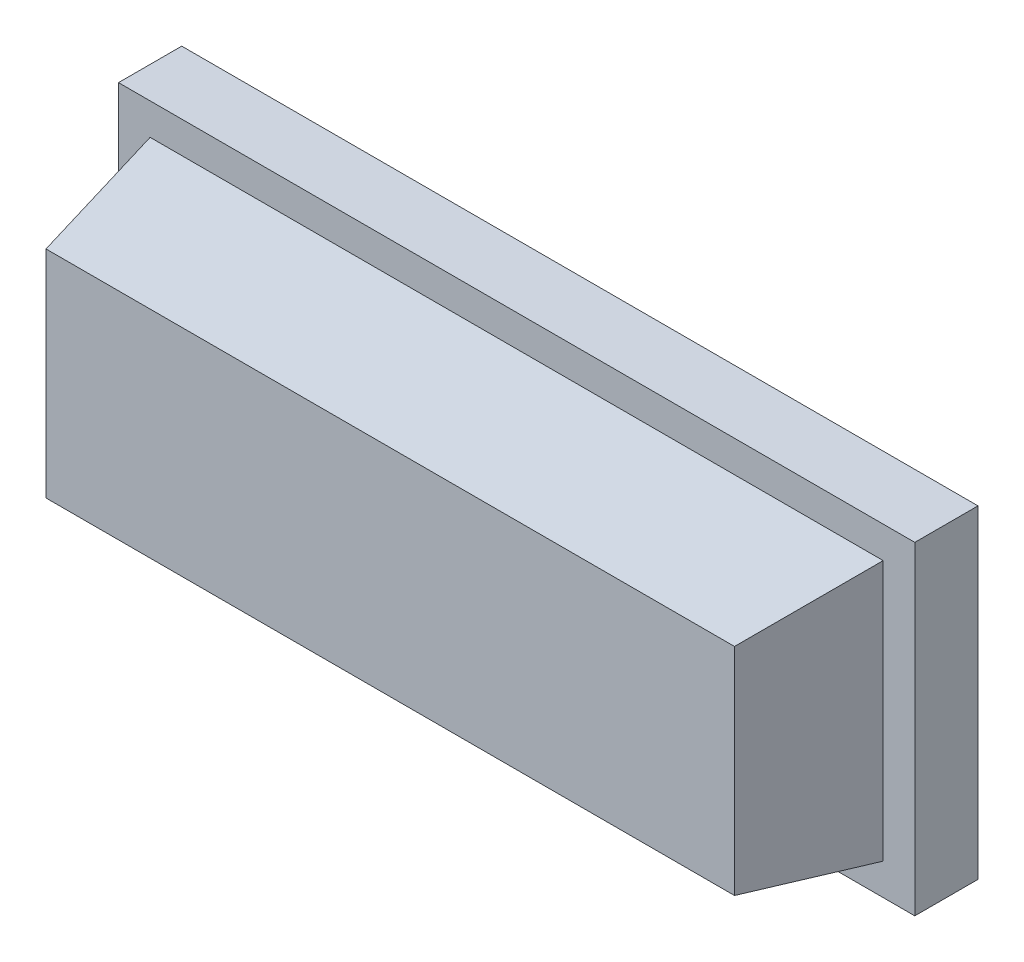
ISO-10303-21;
HEADER;
FILE_DESCRIPTION(('STEP AP214'),'2;1');
FILE_NAME('part.step','',(''),(''),'','','');
FILE_SCHEMA(('AUTOMOTIVE_DESIGN { 1 0 10303 214 1 1 1 1 }'));
ENDSEC;
DATA;
#1=APPLICATION_CONTEXT('core data for automotive mechanical design processes');
#2=APPLICATION_PROTOCOL_DEFINITION('international standard','automotive_design',2000,#1);
#3=PRODUCT_CONTEXT('',#1,'mechanical');
#4=PRODUCT('Part','Part','',(#3));
#5=PRODUCT_RELATED_PRODUCT_CATEGORY('part','',(#4));
#6=PRODUCT_DEFINITION_FORMATION('','',#4);
#7=PRODUCT_DEFINITION_CONTEXT('part definition',#1,'design');
#8=PRODUCT_DEFINITION('design','',#6,#7);
#9=PRODUCT_DEFINITION_SHAPE('','',#8);
#10=(LENGTH_UNIT() NAMED_UNIT(*) SI_UNIT(.MILLI.,.METRE.));
#11=(NAMED_UNIT(*) PLANE_ANGLE_UNIT() SI_UNIT($,.RADIAN.));
#12=(NAMED_UNIT(*) SI_UNIT($,.STERADIAN.) SOLID_ANGLE_UNIT());
#13=UNCERTAINTY_MEASURE_WITH_UNIT(LENGTH_MEASURE(1.E-05),#10,'distance_accuracy_value','');
#14=(GEOMETRIC_REPRESENTATION_CONTEXT(3) GLOBAL_UNCERTAINTY_ASSIGNED_CONTEXT((#13)) GLOBAL_UNIT_ASSIGNED_CONTEXT((#10,
#11,#12)) REPRESENTATION_CONTEXT('',''));
#15=CARTESIAN_POINT('',(0.,0.,0.));
#16=DIRECTION('',(0.,0.,1.));
#17=DIRECTION('',(1.,0.,0.));
#18=AXIS2_PLACEMENT_3D('',#15,#16,#17);
#19=CARTESIAN_POINT('',(0.,0.,0.254));
#20=DIRECTION('',(0.,0.,1.));
#21=DIRECTION('',(1.,0.,0.));
#22=AXIS2_PLACEMENT_3D('',#19,#20,#21);
#23=PLANE('',#22);
#24=DIRECTION('',(0.,-1.,0.));
#25=VECTOR('',#24,1.);
#26=CARTESIAN_POINT('',(-1.6,0.65,0.254));
#27=LINE('',#26,#25);
#28=CARTESIAN_POINT('',(-1.6,0.65,0.254));
#29=VERTEX_POINT('',#28);
#30=CARTESIAN_POINT('',(-1.6,-0.65,0.254));
#31=VERTEX_POINT('',#30);
#32=EDGE_CURVE('E147',#29,#31,#27,.T.);
#33=ORIENTED_EDGE('',*,*,#32,.T.);
#34=DIRECTION('',(1.,0.,0.));
#35=VECTOR('',#34,1.);
#36=CARTESIAN_POINT('',(-1.6,-0.65,0.254));
#37=LINE('',#36,#35);
#38=CARTESIAN_POINT('',(1.6,-0.65,0.254));
#39=VERTEX_POINT('',#38);
#40=EDGE_CURVE('E85',#31,#39,#37,.T.);
#41=ORIENTED_EDGE('',*,*,#40,.T.);
#42=DIRECTION('',(0.,1.,0.));
#43=VECTOR('',#42,1.);
#44=CARTESIAN_POINT('',(1.6,0.65,0.254));
#45=LINE('',#44,#43);
#46=CARTESIAN_POINT('',(1.6,0.65,0.254));
#47=VERTEX_POINT('',#46);
#48=EDGE_CURVE('E150',#39,#47,#45,.T.);
#49=ORIENTED_EDGE('',*,*,#48,.T.);
#50=DIRECTION('',(-1.,0.,0.));
#51=VECTOR('',#50,1.);
#52=CARTESIAN_POINT('',(-1.6,0.65,0.254));
#53=LINE('',#52,#51);
#54=EDGE_CURVE('E57',#47,#29,#53,.T.);
#55=ORIENTED_EDGE('',*,*,#54,.T.);
#56=EDGE_LOOP('',(#33,#41,#49,#55));
#57=FACE_BOUND('',#56,.T.);
#58=DIRECTION('',(1.,0.,0.));
#59=VECTOR('',#58,1.);
#60=CARTESIAN_POINT('',(-1.473,-0.523,0.254));
#61=LINE('',#60,#59);
#62=CARTESIAN_POINT('',(-1.473,-0.523,0.254));
#63=VERTEX_POINT('',#62);
#64=CARTESIAN_POINT('',(1.473,-0.523,0.254));
#65=VERTEX_POINT('',#64);
#66=EDGE_CURVE('E112',#63,#65,#61,.T.);
#67=ORIENTED_EDGE('',*,*,#66,.F.);
#68=DIRECTION('',(0.,-1.,0.));
#69=VECTOR('',#68,1.);
#70=CARTESIAN_POINT('',(-1.473,0.523,0.254));
#71=LINE('',#70,#69);
#72=CARTESIAN_POINT('',(-1.473,0.523,0.254));
#73=VERTEX_POINT('',#72);
#74=EDGE_CURVE('E123',#73,#63,#71,.T.);
#75=ORIENTED_EDGE('',*,*,#74,.F.);
#76=DIRECTION('',(-1.,0.,0.));
#77=VECTOR('',#76,1.);
#78=CARTESIAN_POINT('',(-1.473,0.523,0.254));
#79=LINE('',#78,#77);
#80=CARTESIAN_POINT('',(1.473,0.523,0.254));
#81=VERTEX_POINT('',#80);
#82=EDGE_CURVE('E133',#81,#73,#79,.T.);
#83=ORIENTED_EDGE('',*,*,#82,.F.);
#84=DIRECTION('',(0.,1.,0.));
#85=VECTOR('',#84,1.);
#86=CARTESIAN_POINT('',(1.473,0.523,0.254));
#87=LINE('',#86,#85);
#88=EDGE_CURVE('E131',#65,#81,#87,.T.);
#89=ORIENTED_EDGE('',*,*,#88,.F.);
#90=EDGE_LOOP('',(#67,#75,#83,#89));
#91=FACE_BOUND('',#90,.T.);
#92=ADVANCED_FACE('F33',(#57,#91),#23,.T.);
#93=CARTESIAN_POINT('',(-1.6,0.65,0.254));
#94=DIRECTION('',(1.,0.,0.));
#95=DIRECTION('',(0.,1.,0.));
#96=AXIS2_PLACEMENT_3D('',#93,#94,#95);
#97=PLANE('',#96);
#98=DIRECTION('',(0.,-1.,0.));
#99=VECTOR('',#98,1.);
#100=CARTESIAN_POINT('',(-1.6,0.65,0.));
#101=LINE('',#100,#99);
#102=CARTESIAN_POINT('',(-1.6,0.65,0.));
#103=VERTEX_POINT('',#102);
#104=CARTESIAN_POINT('',(-1.6,-0.65,0.));
#105=VERTEX_POINT('',#104);
#106=EDGE_CURVE('E118',#103,#105,#101,.T.);
#107=ORIENTED_EDGE('',*,*,#106,.T.);
#108=DIRECTION('',(0.,0.,-1.));
#109=VECTOR('',#108,1.);
#110=CARTESIAN_POINT('',(-1.6,-0.65,0.254));
#111=LINE('',#110,#109);
#112=EDGE_CURVE('E11',#31,#105,#111,.T.);
#113=ORIENTED_EDGE('',*,*,#112,.F.);
#114=ORIENTED_EDGE('',*,*,#32,.F.);
#115=DIRECTION('',(0.,0.,-1.));
#116=VECTOR('',#115,1.);
#117=CARTESIAN_POINT('',(-1.6,0.65,0.254));
#118=LINE('',#117,#116);
#119=EDGE_CURVE('E153',#29,#103,#118,.T.);
#120=ORIENTED_EDGE('',*,*,#119,.T.);
#121=EDGE_LOOP('',(#107,#113,#114,#120));
#122=FACE_BOUND('',#121,.T.);
#123=ADVANCED_FACE('F35',(#122),#97,.F.);
#124=CARTESIAN_POINT('',(-1.6,-0.65,0.254));
#125=DIRECTION('',(0.,1.,0.));
#126=DIRECTION('',(0.,0.,1.));
#127=AXIS2_PLACEMENT_3D('',#124,#125,#126);
#128=PLANE('',#127);
#129=DIRECTION('',(1.,0.,0.));
#130=VECTOR('',#129,1.);
#131=CARTESIAN_POINT('',(-1.6,-0.65,0.));
#132=LINE('',#131,#130);
#133=CARTESIAN_POINT('',(1.6,-0.65,0.));
#134=VERTEX_POINT('',#133);
#135=EDGE_CURVE('E156',#105,#134,#132,.T.);
#136=ORIENTED_EDGE('',*,*,#135,.T.);
#137=DIRECTION('',(0.,0.,-1.));
#138=VECTOR('',#137,1.);
#139=CARTESIAN_POINT('',(1.6,-0.65,0.254));
#140=LINE('',#139,#138);
#141=EDGE_CURVE('E41',#39,#134,#140,.T.);
#142=ORIENTED_EDGE('',*,*,#141,.F.);
#143=ORIENTED_EDGE('',*,*,#40,.F.);
#144=ORIENTED_EDGE('',*,*,#112,.T.);
#145=EDGE_LOOP('',(#136,#142,#143,#144));
#146=FACE_BOUND('',#145,.T.);
#147=ADVANCED_FACE('F183',(#146),#128,.F.);
#148=CARTESIAN_POINT('',(1.6,0.65,0.254));
#149=DIRECTION('',(-1.,0.,0.));
#150=DIRECTION('',(0.,-1.,0.));
#151=AXIS2_PLACEMENT_3D('',#148,#149,#150);
#152=PLANE('',#151);
#153=DIRECTION('',(0.,1.,0.));
#154=VECTOR('',#153,1.);
#155=CARTESIAN_POINT('',(1.6,0.65,0.));
#156=LINE('',#155,#154);
#157=CARTESIAN_POINT('',(1.6,0.65,0.));
#158=VERTEX_POINT('',#157);
#159=EDGE_CURVE('E158',#134,#158,#156,.T.);
#160=ORIENTED_EDGE('',*,*,#159,.T.);
#161=DIRECTION('',(0.,0.,-1.));
#162=VECTOR('',#161,1.);
#163=CARTESIAN_POINT('',(1.6,0.65,0.254));
#164=LINE('',#163,#162);
#165=EDGE_CURVE('E162',#47,#158,#164,.T.);
#166=ORIENTED_EDGE('',*,*,#165,.F.);
#167=ORIENTED_EDGE('',*,*,#48,.F.);
#168=ORIENTED_EDGE('',*,*,#141,.T.);
#169=EDGE_LOOP('',(#160,#166,#167,#168));
#170=FACE_BOUND('',#169,.T.);
#171=ADVANCED_FACE('F167',(#170),#152,.F.);
#172=CARTESIAN_POINT('',(-1.6,0.65,0.254));
#173=DIRECTION('',(0.,-1.,0.));
#174=DIRECTION('',(0.,0.,-1.));
#175=AXIS2_PLACEMENT_3D('',#172,#173,#174);
#176=PLANE('',#175);
#177=DIRECTION('',(-1.,0.,0.));
#178=VECTOR('',#177,1.);
#179=CARTESIAN_POINT('',(-1.6,0.65,0.));
#180=LINE('',#179,#178);
#181=EDGE_CURVE('E78',#158,#103,#180,.T.);
#182=ORIENTED_EDGE('',*,*,#181,.T.);
#183=ORIENTED_EDGE('',*,*,#119,.F.);
#184=ORIENTED_EDGE('',*,*,#54,.F.);
#185=ORIENTED_EDGE('',*,*,#165,.T.);
#186=EDGE_LOOP('',(#182,#183,#184,#185));
#187=FACE_BOUND('',#186,.T.);
#188=ADVANCED_FACE('F175',(#187),#176,.F.);
#189=CARTESIAN_POINT('',(0.,0.,0.));
#190=DIRECTION('',(0.,0.,1.));
#191=DIRECTION('',(1.,0.,0.));
#192=AXIS2_PLACEMENT_3D('',#189,#190,#191);
#193=PLANE('',#192);
#194=ORIENTED_EDGE('',*,*,#106,.F.);
#195=ORIENTED_EDGE('',*,*,#181,.F.);
#196=ORIENTED_EDGE('',*,*,#159,.F.);
#197=ORIENTED_EDGE('',*,*,#135,.F.);
#198=EDGE_LOOP('',(#194,#195,#196,#197));
#199=FACE_BOUND('',#198,.T.);
#200=ADVANCED_FACE('F171',(#199),#193,.F.);
#201=CARTESIAN_POINT('',(-1.473,0.523,0.254));
#202=DIRECTION('',(-0.984807753012208,0.,0.173648177666931));
#203=DIRECTION('',(0.173648177666931,0.,0.984807753012208));
#204=AXIS2_PLACEMENT_3D('',#201,#202,#203);
#205=PLANE('',#204);
#206=ORIENTED_EDGE('',*,*,#74,.T.);
#207=DIRECTION('',(-0.171087869746036,-0.171087869746036,-0.970287525247814));
#208=VECTOR('',#207,1.);
#209=CARTESIAN_POINT('',(-1.473,-0.523,0.254));
#210=LINE('',#209,#208);
#211=CARTESIAN_POINT('',(-1.3834258938001,-0.4334258938001,0.762));
#212=VERTEX_POINT('',#211);
#213=EDGE_CURVE('E107',#212,#63,#210,.T.);
#214=ORIENTED_EDGE('',*,*,#213,.F.);
#215=DIRECTION('',(0.,1.,0.));
#216=VECTOR('',#215,1.);
#217=CARTESIAN_POINT('',(-1.3834258938001,0.523,0.762));
#218=LINE('',#217,#216);
#219=CARTESIAN_POINT('',(-1.3834258938001,0.4334258938001,0.762));
#220=VERTEX_POINT('',#219);
#221=EDGE_CURVE('E136',#220,#212,#218,.F.);
#222=ORIENTED_EDGE('',*,*,#221,.F.);
#223=DIRECTION('',(-0.171087869746036,0.171087869746036,-0.970287525247814));
#224=VECTOR('',#223,1.);
#225=CARTESIAN_POINT('',(-1.473,0.523,0.254));
#226=LINE('',#225,#224);
#227=EDGE_CURVE('E126',#220,#73,#226,.T.);
#228=ORIENTED_EDGE('',*,*,#227,.T.);
#229=EDGE_LOOP('',(#206,#214,#222,#228));
#230=FACE_BOUND('',#229,.T.);
#231=ADVANCED_FACE('F124',(#230),#205,.T.);
#232=CARTESIAN_POINT('',(-1.473,-0.523,0.254));
#233=DIRECTION('',(0.,-0.984807753012208,0.173648177666931));
#234=DIRECTION('',(0.,-0.173648177666931,-0.984807753012208));
#235=AXIS2_PLACEMENT_3D('',#232,#233,#234);
#236=PLANE('',#235);
#237=ORIENTED_EDGE('',*,*,#66,.T.);
#238=DIRECTION('',(0.171087869746036,-0.171087869746036,-0.970287525247814));
#239=VECTOR('',#238,1.);
#240=CARTESIAN_POINT('',(1.44238247210375,-0.492382472103749,0.427640629319648));
#241=LINE('',#240,#239);
#242=CARTESIAN_POINT('',(1.3834258938001,-0.4334258938001,0.762));
#243=VERTEX_POINT('',#242);
#244=EDGE_CURVE('E119',#243,#65,#241,.T.);
#245=ORIENTED_EDGE('',*,*,#244,.F.);
#246=DIRECTION('',(-1.,0.,0.));
#247=VECTOR('',#246,1.);
#248=CARTESIAN_POINT('',(-1.473,-0.4334258938001,0.762));
#249=LINE('',#248,#247);
#250=EDGE_CURVE('E114',#212,#243,#249,.F.);
#251=ORIENTED_EDGE('',*,*,#250,.F.);
#252=ORIENTED_EDGE('',*,*,#213,.T.);
#253=EDGE_LOOP('',(#237,#245,#251,#252));
#254=FACE_BOUND('',#253,.T.);
#255=ADVANCED_FACE('F109',(#254),#236,.T.);
#256=CARTESIAN_POINT('',(1.473,0.523,0.254));
#257=DIRECTION('',(0.984807753012208,0.,0.173648177666931));
#258=DIRECTION('',(0.173648177666931,0.,-0.984807753012208));
#259=AXIS2_PLACEMENT_3D('',#256,#257,#258);
#260=PLANE('',#259);
#261=ORIENTED_EDGE('',*,*,#88,.T.);
#262=DIRECTION('',(0.171087869746036,0.171087869746036,-0.970287525247814));
#263=VECTOR('',#262,1.);
#264=CARTESIAN_POINT('',(1.3867674596727,0.436767459672699,0.743049038217671));
#265=LINE('',#264,#263);
#266=CARTESIAN_POINT('',(1.3834258938001,0.4334258938001,0.762));
#267=VERTEX_POINT('',#266);
#268=EDGE_CURVE('E48',#267,#81,#265,.T.);
#269=ORIENTED_EDGE('',*,*,#268,.F.);
#270=DIRECTION('',(0.,-1.,0.));
#271=VECTOR('',#270,1.);
#272=CARTESIAN_POINT('',(1.3834258938001,0.523,0.762));
#273=LINE('',#272,#271);
#274=EDGE_CURVE('E144',#243,#267,#273,.F.);
#275=ORIENTED_EDGE('',*,*,#274,.F.);
#276=ORIENTED_EDGE('',*,*,#244,.T.);
#277=EDGE_LOOP('',(#261,#269,#275,#276));
#278=FACE_BOUND('',#277,.T.);
#279=ADVANCED_FACE('F193',(#278),#260,.T.);
#280=CARTESIAN_POINT('',(-1.473,0.523,0.254));
#281=DIRECTION('',(0.,0.984807753012208,0.173648177666931));
#282=DIRECTION('',(0.,-0.173648177666931,0.984807753012208));
#283=AXIS2_PLACEMENT_3D('',#280,#281,#282);
#284=PLANE('',#283);
#285=ORIENTED_EDGE('',*,*,#82,.T.);
#286=ORIENTED_EDGE('',*,*,#227,.F.);
#287=DIRECTION('',(1.,0.,0.));
#288=VECTOR('',#287,1.);
#289=CARTESIAN_POINT('',(-1.473,0.4334258938001,0.762));
#290=LINE('',#289,#288);
#291=EDGE_CURVE('E139',#267,#220,#290,.F.);
#292=ORIENTED_EDGE('',*,*,#291,.F.);
#293=ORIENTED_EDGE('',*,*,#268,.T.);
#294=EDGE_LOOP('',(#285,#286,#292,#293));
#295=FACE_BOUND('',#294,.T.);
#296=ADVANCED_FACE('F196',(#295),#284,.T.);
#297=CARTESIAN_POINT('',(0.,0.,0.762));
#298=DIRECTION('',(0.,0.,1.));
#299=DIRECTION('',(1.,0.,0.));
#300=AXIS2_PLACEMENT_3D('',#297,#298,#299);
#301=PLANE('',#300);
#302=ORIENTED_EDGE('',*,*,#221,.T.);
#303=ORIENTED_EDGE('',*,*,#250,.T.);
#304=ORIENTED_EDGE('',*,*,#274,.T.);
#305=ORIENTED_EDGE('',*,*,#291,.T.);
#306=EDGE_LOOP('',(#302,#303,#304,#305));
#307=FACE_BOUND('',#306,.T.);
#308=ADVANCED_FACE('F200',(#307),#301,.T.);
#309=CLOSED_SHELL('',(#92,#123,#147,#171,#188,#200,#231,#255,#279,#296,#308));
#310=MANIFOLD_SOLID_BREP('B2',#309);
#311=ADVANCED_BREP_SHAPE_REPRESENTATION('',(#18,#310),#14);
#312=SHAPE_DEFINITION_REPRESENTATION(#9,#311);
ENDSEC;
END-ISO-10303-21;
